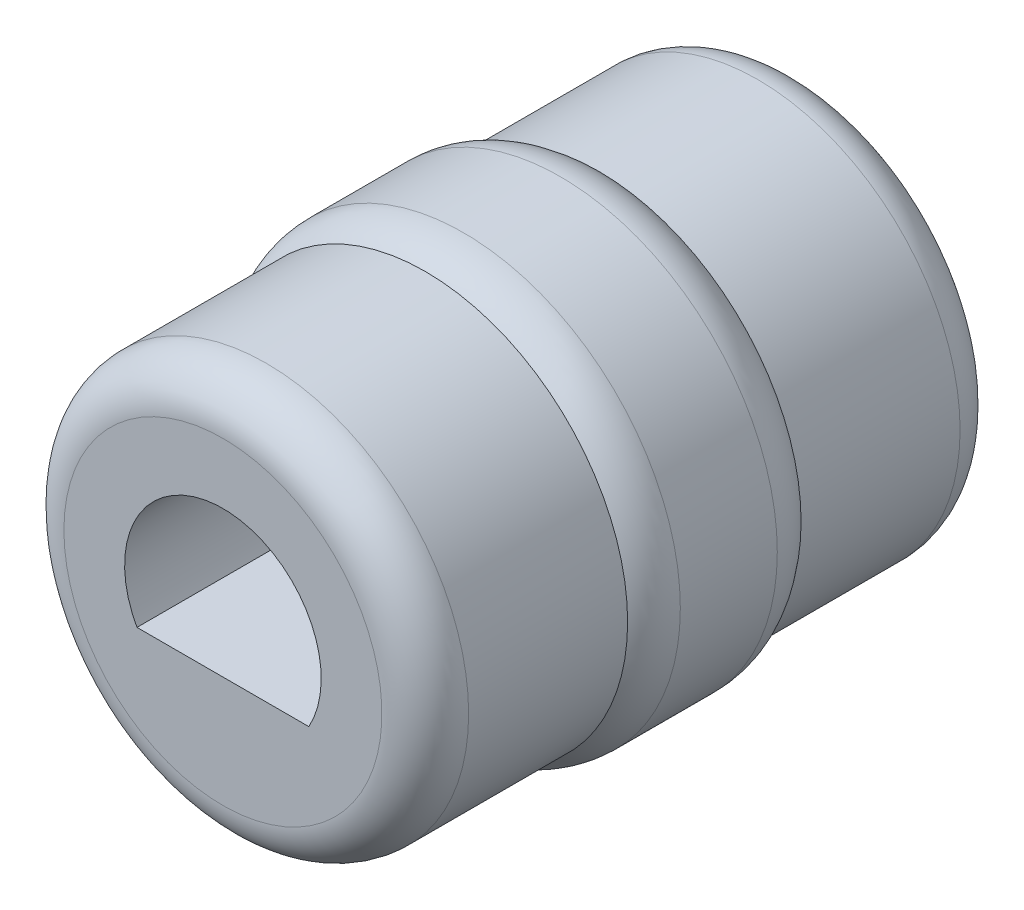
ISO-10303-21;
HEADER;
FILE_DESCRIPTION(('STEP AP214'),'2;1');
FILE_NAME('part.step','',(''),(''),'','','');
FILE_SCHEMA(('AUTOMOTIVE_DESIGN { 1 0 10303 214 1 1 1 1 }'));
ENDSEC;
DATA;
#1=APPLICATION_CONTEXT('core data for automotive mechanical design processes');
#2=APPLICATION_PROTOCOL_DEFINITION('international standard','automotive_design',2000,#1);
#3=PRODUCT_CONTEXT('',#1,'mechanical');
#4=PRODUCT('Part','Part','',(#3));
#5=PRODUCT_RELATED_PRODUCT_CATEGORY('part','',(#4));
#6=PRODUCT_DEFINITION_FORMATION('','',#4);
#7=PRODUCT_DEFINITION_CONTEXT('part definition',#1,'design');
#8=PRODUCT_DEFINITION('design','',#6,#7);
#9=PRODUCT_DEFINITION_SHAPE('','',#8);
#10=(LENGTH_UNIT() NAMED_UNIT(*) SI_UNIT(.MILLI.,.METRE.));
#11=(NAMED_UNIT(*) PLANE_ANGLE_UNIT() SI_UNIT($,.RADIAN.));
#12=(NAMED_UNIT(*) SI_UNIT($,.STERADIAN.) SOLID_ANGLE_UNIT());
#13=UNCERTAINTY_MEASURE_WITH_UNIT(LENGTH_MEASURE(1.E-05),#10,'distance_accuracy_value','');
#14=(GEOMETRIC_REPRESENTATION_CONTEXT(3) GLOBAL_UNCERTAINTY_ASSIGNED_CONTEXT((#13)) GLOBAL_UNIT_ASSIGNED_CONTEXT((#10,
#11,#12)) REPRESENTATION_CONTEXT('',''));
#15=CARTESIAN_POINT('',(0.,0.,0.));
#16=DIRECTION('',(0.,0.,1.));
#17=DIRECTION('',(1.,0.,0.));
#18=AXIS2_PLACEMENT_3D('',#15,#16,#17);
#19=CARTESIAN_POINT('',(0.,7.,0.));
#20=DIRECTION('',(0.,0.,-1.));
#21=DIRECTION('',(-1.,0.,0.));
#22=AXIS2_PLACEMENT_3D('',#19,#20,#21);
#23=PLANE('',#22);
#24=DIRECTION('',(-1.,0.,0.));
#25=VECTOR('',#24,1.);
#26=CARTESIAN_POINT('',(2.24599643810938,4.82,0.));
#27=LINE('',#26,#25);
#28=CARTESIAN_POINT('',(2.24599643810938,4.82,0.));
#29=VERTEX_POINT('',#28);
#30=CARTESIAN_POINT('',(-2.24599643810938,4.82,0.));
#31=VERTEX_POINT('',#30);
#32=EDGE_CURVE('E54',#29,#31,#27,.T.);
#33=ORIENTED_EDGE('',*,*,#32,.T.);
#34=CARTESIAN_POINT('',(0.,7.,0.));
#35=DIRECTION('',(0.,0.,-1.));
#36=DIRECTION('',(-1.,0.,0.));
#37=AXIS2_PLACEMENT_3D('',#34,#35,#36);
#38=CIRCLE('',#37,3.13);
#39=CARTESIAN_POINT('',(-2.65977442652568,5.35,0.));
#40=VERTEX_POINT('',#39);
#41=EDGE_CURVE('E109',#31,#40,#38,.T.);
#42=ORIENTED_EDGE('',*,*,#41,.T.);
#43=DIRECTION('',(1.,0.,0.));
#44=VECTOR('',#43,1.);
#45=CARTESIAN_POINT('',(2.97279329923895,5.35,0.));
#46=LINE('',#45,#44);
#47=CARTESIAN_POINT('',(2.65977442652568,5.35,0.));
#48=VERTEX_POINT('',#47);
#49=EDGE_CURVE('E151',#40,#48,#46,.T.);
#50=ORIENTED_EDGE('',*,*,#49,.T.);
#51=CARTESIAN_POINT('',(0.,7.,0.));
#52=DIRECTION('',(0.,0.,-1.));
#53=DIRECTION('',(-1.,0.,0.));
#54=AXIS2_PLACEMENT_3D('',#51,#52,#53);
#55=CIRCLE('',#54,3.13);
#56=EDGE_CURVE('E59',#48,#29,#55,.T.);
#57=ORIENTED_EDGE('',*,*,#56,.T.);
#58=EDGE_LOOP('',(#33,#42,#50,#57));
#59=FACE_BOUND('',#58,.T.);
#60=ADVANCED_FACE('F38',(#59),#23,.T.);
#61=CARTESIAN_POINT('',(0.,0.,0.));
#62=DIRECTION('',(0.,0.,1.));
#63=DIRECTION('',(1.,0.,0.));
#64=AXIS2_PLACEMENT_3D('',#61,#62,#63);
#65=PLANE('',#64);
#66=CARTESIAN_POINT('',(0.,7.,0.));
#67=DIRECTION('',(0.,0.,1.));
#68=DIRECTION('',(1.,0.,0.));
#69=AXIS2_PLACEMENT_3D('',#66,#67,#68);
#70=CIRCLE('',#69,3.4);
#71=CARTESIAN_POINT('',(2.97279329923895,5.35,0.));
#72=VERTEX_POINT('',#71);
#73=CARTESIAN_POINT('',(-2.97279329923895,5.35,0.));
#74=VERTEX_POINT('',#73);
#75=EDGE_CURVE('E145',#72,#74,#70,.T.);
#76=ORIENTED_EDGE('',*,*,#75,.T.);
#77=EDGE_CURVE('E106',#74,#40,#46,.T.);
#78=ORIENTED_EDGE('',*,*,#77,.T.);
#79=CARTESIAN_POINT('',(-2.24599643810938,9.18,0.));
#80=VERTEX_POINT('',#79);
#81=EDGE_CURVE('E99',#40,#80,#38,.T.);
#82=ORIENTED_EDGE('',*,*,#81,.T.);
#83=DIRECTION('',(1.,0.,0.));
#84=VECTOR('',#83,1.);
#85=CARTESIAN_POINT('',(-2.24599643810938,9.18,0.));
#86=LINE('',#85,#84);
#87=CARTESIAN_POINT('',(2.24599643810938,9.18,0.));
#88=VERTEX_POINT('',#87);
#89=EDGE_CURVE('E104',#80,#88,#86,.T.);
#90=ORIENTED_EDGE('',*,*,#89,.T.);
#91=EDGE_CURVE('E125',#88,#48,#55,.T.);
#92=ORIENTED_EDGE('',*,*,#91,.T.);
#93=EDGE_CURVE('E147',#48,#72,#46,.T.);
#94=ORIENTED_EDGE('',*,*,#93,.T.);
#95=EDGE_LOOP('',(#76,#78,#82,#90,#92,#94));
#96=FACE_BOUND('',#95,.T.);
#97=ADVANCED_FACE('F101',(#96),#65,.T.);
#98=CARTESIAN_POINT('',(-7.,14.,10.));
#99=DIRECTION('',(0.,0.,-1.));
#100=DIRECTION('',(-1.,0.,0.));
#101=AXIS2_PLACEMENT_3D('',#98,#99,#100);
#102=PLANE('',#101);
#103=CARTESIAN_POINT('',(0.,7.,10.));
#104=DIRECTION('',(0.,0.,1.));
#105=DIRECTION('',(1.,0.,0.));
#106=AXIS2_PLACEMENT_3D('',#103,#104,#105);
#107=CIRCLE('',#106,3.4);
#108=CARTESIAN_POINT('',(2.97279329923895,5.35,10.));
#109=VERTEX_POINT('',#108);
#110=CARTESIAN_POINT('',(-2.97279329923895,5.35,10.));
#111=VERTEX_POINT('',#110);
#112=EDGE_CURVE('E141',#109,#111,#107,.T.);
#113=ORIENTED_EDGE('',*,*,#112,.F.);
#114=DIRECTION('',(1.,0.,0.));
#115=VECTOR('',#114,1.);
#116=CARTESIAN_POINT('',(2.97279329923895,5.35,10.));
#117=LINE('',#116,#115);
#118=EDGE_CURVE('E148',#111,#109,#117,.T.);
#119=ORIENTED_EDGE('',*,*,#118,.F.);
#120=EDGE_LOOP('',(#113,#119));
#121=FACE_BOUND('',#120,.T.);
#122=CARTESIAN_POINT('',(0.,7.,10.));
#123=DIRECTION('',(0.,0.,-1.));
#124=DIRECTION('',(-1.,0.,0.));
#125=AXIS2_PLACEMENT_3D('',#122,#123,#124);
#126=CIRCLE('',#125,5.5);
#127=CARTESIAN_POINT('',(-5.5,7.,10.));
#128=VERTEX_POINT('',#127);
#129=EDGE_CURVE('E47',#128,#128,#126,.F.);
#130=ORIENTED_EDGE('',*,*,#129,.T.);
#131=EDGE_LOOP('',(#130));
#132=FACE_BOUND('',#131,.T.);
#133=ADVANCED_FACE('F185',(#121,#132),#102,.F.);
#134=CARTESIAN_POINT('',(0.,7.,-10.));
#135=DIRECTION('',(0.,0.,1.));
#136=DIRECTION('',(1.,0.,0.));
#137=AXIS2_PLACEMENT_3D('',#134,#135,#136);
#138=CYLINDRICAL_SURFACE('',#137,7.);
#139=CARTESIAN_POINT('',(0.,7.,-8.5));
#140=DIRECTION('',(0.,0.,1.));
#141=DIRECTION('',(1.,0.,0.));
#142=AXIS2_PLACEMENT_3D('',#139,#140,#141);
#143=CIRCLE('',#142,7.);
#144=CARTESIAN_POINT('',(7.,7.,-8.5));
#145=VERTEX_POINT('',#144);
#146=EDGE_CURVE('E173',#145,#145,#143,.T.);
#147=ORIENTED_EDGE('',*,*,#146,.T.);
#148=EDGE_LOOP('',(#147));
#149=FACE_BOUND('',#148,.T.);
#150=CARTESIAN_POINT('',(0.,7.,-3.));
#151=DIRECTION('',(0.,0.,1.));
#152=DIRECTION('',(1.,0.,0.));
#153=AXIS2_PLACEMENT_3D('',#150,#151,#152);
#154=CIRCLE('',#153,7.);
#155=CARTESIAN_POINT('',(7.,7.,-3.));
#156=VERTEX_POINT('',#155);
#157=EDGE_CURVE('E160',#156,#156,#154,.T.);
#158=ORIENTED_EDGE('',*,*,#157,.F.);
#159=EDGE_LOOP('',(#158));
#160=FACE_BOUND('',#159,.T.);
#161=ADVANCED_FACE('F389',(#149,#160),#138,.T.);
#162=CARTESIAN_POINT('',(0.,7.,8.5));
#163=DIRECTION('',(0.,0.,-1.));
#164=DIRECTION('',(-1.,0.,0.));
#165=AXIS2_PLACEMENT_3D('',#162,#163,#164);
#166=CIRCLE('',#165,7.);
#167=CARTESIAN_POINT('',(-7.,7.,8.5));
#168=VERTEX_POINT('',#167);
#169=EDGE_CURVE('E12',#168,#168,#166,.T.);
#170=ORIENTED_EDGE('',*,*,#169,.T.);
#171=EDGE_LOOP('',(#170));
#172=FACE_BOUND('',#171,.T.);
#173=CARTESIAN_POINT('',(0.,7.,3.));
#174=DIRECTION('',(0.,0.,1.));
#175=DIRECTION('',(1.,0.,0.));
#176=AXIS2_PLACEMENT_3D('',#173,#174,#175);
#177=CIRCLE('',#176,7.);
#178=CARTESIAN_POINT('',(7.,7.,3.));
#179=VERTEX_POINT('',#178);
#180=EDGE_CURVE('E163',#179,#179,#177,.F.);
#181=ORIENTED_EDGE('',*,*,#180,.F.);
#182=EDGE_LOOP('',(#181));
#183=FACE_BOUND('',#182,.T.);
#184=ADVANCED_FACE('F221',(#172,#183),#138,.T.);
#185=CARTESIAN_POINT('',(-7.,14.,-10.));
#186=DIRECTION('',(0.,0.,1.));
#187=DIRECTION('',(1.,0.,0.));
#188=AXIS2_PLACEMENT_3D('',#185,#186,#187);
#189=PLANE('',#188);
#190=CARTESIAN_POINT('',(0.,7.,-10.));
#191=DIRECTION('',(0.,0.,1.));
#192=DIRECTION('',(1.,0.,0.));
#193=AXIS2_PLACEMENT_3D('',#190,#191,#192);
#194=CIRCLE('',#193,5.5);
#195=CARTESIAN_POINT('',(5.5,7.,-10.));
#196=VERTEX_POINT('',#195);
#197=EDGE_CURVE('E180',#196,#196,#194,.F.);
#198=ORIENTED_EDGE('',*,*,#197,.T.);
#199=EDGE_LOOP('',(#198));
#200=FACE_BOUND('',#199,.T.);
#201=CARTESIAN_POINT('',(0.,7.,-10.));
#202=DIRECTION('',(0.,0.,-1.));
#203=DIRECTION('',(-1.,0.,0.));
#204=AXIS2_PLACEMENT_3D('',#201,#202,#203);
#205=CIRCLE('',#204,3.13);
#206=CARTESIAN_POINT('',(-2.24599643810938,4.82,-10.));
#207=VERTEX_POINT('',#206);
#208=CARTESIAN_POINT('',(-2.24599643810938,9.18,-10.));
#209=VERTEX_POINT('',#208);
#210=EDGE_CURVE('E116',#207,#209,#205,.T.);
#211=ORIENTED_EDGE('',*,*,#210,.F.);
#212=DIRECTION('',(-1.,0.,0.));
#213=VECTOR('',#212,1.);
#214=CARTESIAN_POINT('',(2.24599643810938,4.82,-10.));
#215=LINE('',#214,#213);
#216=CARTESIAN_POINT('',(2.24599643810938,4.82,-10.));
#217=VERTEX_POINT('',#216);
#218=EDGE_CURVE('E110',#217,#207,#215,.T.);
#219=ORIENTED_EDGE('',*,*,#218,.F.);
#220=CARTESIAN_POINT('',(0.,7.,-10.));
#221=DIRECTION('',(0.,0.,-1.));
#222=DIRECTION('',(-1.,0.,0.));
#223=AXIS2_PLACEMENT_3D('',#220,#221,#222);
#224=CIRCLE('',#223,3.13);
#225=CARTESIAN_POINT('',(2.24599643810938,9.18,-10.));
#226=VERTEX_POINT('',#225);
#227=EDGE_CURVE('E134',#226,#217,#224,.T.);
#228=ORIENTED_EDGE('',*,*,#227,.F.);
#229=DIRECTION('',(1.,0.,0.));
#230=VECTOR('',#229,1.);
#231=CARTESIAN_POINT('',(-2.24599643810938,9.18,-10.));
#232=LINE('',#231,#230);
#233=EDGE_CURVE('E131',#209,#226,#232,.T.);
#234=ORIENTED_EDGE('',*,*,#233,.F.);
#235=EDGE_LOOP('',(#211,#219,#228,#234));
#236=FACE_BOUND('',#235,.T.);
#237=ADVANCED_FACE('F210',(#200,#236),#189,.F.);
#238=CARTESIAN_POINT('',(0.,7.,3.));
#239=DIRECTION('',(0.,0.,-1.));
#240=DIRECTION('',(-1.,0.,0.));
#241=AXIS2_PLACEMENT_3D('',#238,#239,#240);
#242=CYLINDRICAL_SURFACE('',#241,7.5);
#243=CARTESIAN_POINT('',(0.,7.,-1.67712434446771));
#244=DIRECTION('',(0.,0.,-1.));
#245=DIRECTION('',(-1.,0.,0.));
#246=AXIS2_PLACEMENT_3D('',#243,#244,#245);
#247=CIRCLE('',#246,7.5);
#248=CARTESIAN_POINT('',(-7.5,7.,-1.67712434446771));
#249=VERTEX_POINT('',#248);
#250=EDGE_CURVE('E170',#249,#249,#247,.F.);
#251=ORIENTED_EDGE('',*,*,#250,.T.);
#252=EDGE_LOOP('',(#251));
#253=FACE_BOUND('',#252,.T.);
#254=CARTESIAN_POINT('',(0.,7.,1.67712434446771));
#255=DIRECTION('',(0.,0.,1.));
#256=DIRECTION('',(1.,0.,0.));
#257=AXIS2_PLACEMENT_3D('',#254,#255,#256);
#258=CIRCLE('',#257,7.5);
#259=CARTESIAN_POINT('',(7.5,7.,1.67712434446771));
#260=VERTEX_POINT('',#259);
#261=EDGE_CURVE('E167',#260,#260,#258,.F.);
#262=ORIENTED_EDGE('',*,*,#261,.T.);
#263=EDGE_LOOP('',(#262));
#264=FACE_BOUND('',#263,.T.);
#265=ADVANCED_FACE('F206',(#253,#264),#242,.T.);
#266=CARTESIAN_POINT('',(0.,7.,1.67712434446771));
#267=DIRECTION('',(0.,0.,1.));
#268=DIRECTION('',(1.,0.,0.));
#269=AXIS2_PLACEMENT_3D('',#266,#267,#268);
#270=TOROIDAL_SURFACE('',#269,5.5,2.);
#271=ORIENTED_EDGE('',*,*,#261,.F.);
#272=EDGE_LOOP('',(#271));
#273=FACE_BOUND('',#272,.T.);
#274=ORIENTED_EDGE('',*,*,#180,.T.);
#275=EDGE_LOOP('',(#274));
#276=FACE_BOUND('',#275,.T.);
#277=ADVANCED_FACE('F209',(#273,#276),#270,.T.);
#278=CARTESIAN_POINT('',(0.,7.,-1.67712434446771));
#279=DIRECTION('',(0.,0.,-1.));
#280=DIRECTION('',(-1.,0.,0.));
#281=AXIS2_PLACEMENT_3D('',#278,#279,#280);
#282=TOROIDAL_SURFACE('',#281,5.5,2.);
#283=ORIENTED_EDGE('',*,*,#157,.T.);
#284=EDGE_LOOP('',(#283));
#285=FACE_BOUND('',#284,.T.);
#286=ORIENTED_EDGE('',*,*,#250,.F.);
#287=EDGE_LOOP('',(#286));
#288=FACE_BOUND('',#287,.T.);
#289=ADVANCED_FACE('F257',(#285,#288),#282,.T.);
#290=CARTESIAN_POINT('',(0.,7.,0.));
#291=DIRECTION('',(0.,0.,1.));
#292=DIRECTION('',(1.,0.,0.));
#293=AXIS2_PLACEMENT_3D('',#290,#291,#292);
#294=CYLINDRICAL_SURFACE('',#293,3.4);
#295=ORIENTED_EDGE('',*,*,#112,.T.);
#296=DIRECTION('',(0.,0.,1.));
#297=VECTOR('',#296,1.);
#298=CARTESIAN_POINT('',(-2.97279329923895,5.35,0.));
#299=LINE('',#298,#297);
#300=EDGE_CURVE('E150',#74,#111,#299,.T.);
#301=ORIENTED_EDGE('',*,*,#300,.F.);
#302=ORIENTED_EDGE('',*,*,#75,.F.);
#303=DIRECTION('',(0.,0.,1.));
#304=VECTOR('',#303,1.);
#305=CARTESIAN_POINT('',(2.97279329923895,5.35,0.));
#306=LINE('',#305,#304);
#307=EDGE_CURVE('E154',#72,#109,#306,.T.);
#308=ORIENTED_EDGE('',*,*,#307,.T.);
#309=EDGE_LOOP('',(#295,#301,#302,#308));
#310=FACE_BOUND('',#309,.T.);
#311=ADVANCED_FACE('F254',(#310),#294,.F.);
#312=CARTESIAN_POINT('',(2.97279329923895,5.35,0.));
#313=DIRECTION('',(0.,-1.,0.));
#314=DIRECTION('',(1.,0.,0.));
#315=AXIS2_PLACEMENT_3D('',#312,#313,#314);
#316=PLANE('',#315);
#317=ORIENTED_EDGE('',*,*,#118,.T.);
#318=ORIENTED_EDGE('',*,*,#307,.F.);
#319=ORIENTED_EDGE('',*,*,#93,.F.);
#320=ORIENTED_EDGE('',*,*,#49,.F.);
#321=ORIENTED_EDGE('',*,*,#77,.F.);
#322=ORIENTED_EDGE('',*,*,#300,.T.);
#323=EDGE_LOOP('',(#317,#318,#319,#320,#321,#322));
#324=FACE_BOUND('',#323,.T.);
#325=ADVANCED_FACE('F251',(#324),#316,.F.);
#326=CARTESIAN_POINT('',(0.,7.,0.));
#327=DIRECTION('',(0.,0.,-1.));
#328=DIRECTION('',(-1.,0.,0.));
#329=AXIS2_PLACEMENT_3D('',#326,#327,#328);
#330=CYLINDRICAL_SURFACE('',#329,3.13);
#331=ORIENTED_EDGE('',*,*,#210,.T.);
#332=DIRECTION('',(0.,0.,-1.));
#333=VECTOR('',#332,1.);
#334=CARTESIAN_POINT('',(-2.24599643810938,9.18,0.));
#335=LINE('',#334,#333);
#336=EDGE_CURVE('E113',#80,#209,#335,.T.);
#337=ORIENTED_EDGE('',*,*,#336,.F.);
#338=ORIENTED_EDGE('',*,*,#81,.F.);
#339=ORIENTED_EDGE('',*,*,#41,.F.);
#340=DIRECTION('',(0.,0.,-1.));
#341=VECTOR('',#340,1.);
#342=CARTESIAN_POINT('',(-2.24599643810938,4.82,0.));
#343=LINE('',#342,#341);
#344=EDGE_CURVE('E139',#31,#207,#343,.T.);
#345=ORIENTED_EDGE('',*,*,#344,.T.);
#346=EDGE_LOOP('',(#331,#337,#338,#339,#345));
#347=FACE_BOUND('',#346,.T.);
#348=ADVANCED_FACE('F114',(#347),#330,.F.);
#349=CARTESIAN_POINT('',(2.24599643810938,4.82,0.));
#350=DIRECTION('',(0.,-1.,0.));
#351=DIRECTION('',(0.,0.,-1.));
#352=AXIS2_PLACEMENT_3D('',#349,#350,#351);
#353=PLANE('',#352);
#354=ORIENTED_EDGE('',*,*,#218,.T.);
#355=ORIENTED_EDGE('',*,*,#344,.F.);
#356=ORIENTED_EDGE('',*,*,#32,.F.);
#357=DIRECTION('',(0.,0.,-1.));
#358=VECTOR('',#357,1.);
#359=CARTESIAN_POINT('',(2.24599643810938,4.82,0.));
#360=LINE('',#359,#358);
#361=EDGE_CURVE('E142',#29,#217,#360,.T.);
#362=ORIENTED_EDGE('',*,*,#361,.T.);
#363=EDGE_LOOP('',(#354,#355,#356,#362));
#364=FACE_BOUND('',#363,.T.);
#365=ADVANCED_FACE('F238',(#364),#353,.F.);
#366=CARTESIAN_POINT('',(0.,7.,0.));
#367=DIRECTION('',(0.,0.,-1.));
#368=DIRECTION('',(-1.,0.,0.));
#369=AXIS2_PLACEMENT_3D('',#366,#367,#368);
#370=CYLINDRICAL_SURFACE('',#369,3.13);
#371=ORIENTED_EDGE('',*,*,#227,.T.);
#372=ORIENTED_EDGE('',*,*,#361,.F.);
#373=ORIENTED_EDGE('',*,*,#56,.F.);
#374=ORIENTED_EDGE('',*,*,#91,.F.);
#375=DIRECTION('',(0.,0.,-1.));
#376=VECTOR('',#375,1.);
#377=CARTESIAN_POINT('',(2.24599643810938,9.18,0.));
#378=LINE('',#377,#376);
#379=EDGE_CURVE('E120',#88,#226,#378,.T.);
#380=ORIENTED_EDGE('',*,*,#379,.T.);
#381=EDGE_LOOP('',(#371,#372,#373,#374,#380));
#382=FACE_BOUND('',#381,.T.);
#383=ADVANCED_FACE('F242',(#382),#370,.F.);
#384=CARTESIAN_POINT('',(-2.24599643810938,9.18,0.));
#385=DIRECTION('',(0.,1.,0.));
#386=DIRECTION('',(0.,0.,1.));
#387=AXIS2_PLACEMENT_3D('',#384,#385,#386);
#388=PLANE('',#387);
#389=ORIENTED_EDGE('',*,*,#233,.T.);
#390=ORIENTED_EDGE('',*,*,#379,.F.);
#391=ORIENTED_EDGE('',*,*,#89,.F.);
#392=ORIENTED_EDGE('',*,*,#336,.T.);
#393=EDGE_LOOP('',(#389,#390,#391,#392));
#394=FACE_BOUND('',#393,.T.);
#395=ADVANCED_FACE('F123',(#394),#388,.F.);
#396=CARTESIAN_POINT('',(0.,7.,-8.5));
#397=DIRECTION('',(0.,0.,1.));
#398=DIRECTION('',(1.,0.,0.));
#399=AXIS2_PLACEMENT_3D('',#396,#397,#398);
#400=TOROIDAL_SURFACE('',#399,5.5,1.5);
#401=ORIENTED_EDGE('',*,*,#197,.F.);
#402=EDGE_LOOP('',(#401));
#403=FACE_BOUND('',#402,.T.);
#404=ORIENTED_EDGE('',*,*,#146,.F.);
#405=EDGE_LOOP('',(#404));
#406=FACE_BOUND('',#405,.T.);
#407=ADVANCED_FACE('F188',(#403,#406),#400,.T.);
#408=CARTESIAN_POINT('',(0.,7.,8.5));
#409=DIRECTION('',(0.,0.,-1.));
#410=DIRECTION('',(-1.,0.,0.));
#411=AXIS2_PLACEMENT_3D('',#408,#409,#410);
#412=TOROIDAL_SURFACE('',#411,5.5,1.5);
#413=ORIENTED_EDGE('',*,*,#169,.F.);
#414=EDGE_LOOP('',(#413));
#415=FACE_BOUND('',#414,.T.);
#416=ORIENTED_EDGE('',*,*,#129,.F.);
#417=EDGE_LOOP('',(#416));
#418=FACE_BOUND('',#417,.T.);
#419=ADVANCED_FACE('F40',(#415,#418),#412,.T.);
#420=CLOSED_SHELL('',(#60,#97,#133,#161,#184,#237,#265,#277,#289,#311,#325,#348,#365,#383,#395,
#407,#419));
#421=CARTESIAN_POINT('',(2.49449393665328,9.8,0.));
#422=DIRECTION('',(0.,1.,0.));
#423=DIRECTION('',(0.,0.,1.));
#424=AXIS2_PLACEMENT_3D('',#421,#422,#423);
#425=PLANE('',#424);
#426=CARTESIAN_POINT('',(0.,9.8,-5.));
#427=DIRECTION('',(0.,1.,0.));
#428=DIRECTION('',(0.,0.,1.));
#429=AXIS2_PLACEMENT_3D('',#426,#427,#428);
#430=CIRCLE('',#429,1.3);
#431=CARTESIAN_POINT('',(0.,9.8,-3.7));
#432=VERTEX_POINT('',#431);
#433=EDGE_CURVE('E164',#432,#432,#430,.T.);
#434=ORIENTED_EDGE('',*,*,#433,.T.);
#435=EDGE_LOOP('',(#434));
#436=FACE_BOUND('',#435,.T.);
#437=ADVANCED_FACE('F217',(#436),#425,.T.);
#438=CARTESIAN_POINT('',(0.,16.,-5.));
#439=DIRECTION('',(0.,-1.,0.));
#440=DIRECTION('',(0.,0.,-1.));
#441=AXIS2_PLACEMENT_3D('',#438,#439,#440);
#442=CYLINDRICAL_SURFACE('',#441,1.3);
#443=ORIENTED_EDGE('',*,*,#433,.F.);
#444=EDGE_LOOP('',(#443));
#445=FACE_BOUND('',#444,.T.);
#446=CARTESIAN_POINT('',(0.,10.45,-6.3));
#447=CARTESIAN_POINT('',(-0.0703795584851381,10.4500019788307,-6.30000263192643));
#448=CARTESIAN_POINT('',(-0.140741182413693,10.4478277154498,-6.29426685147284));
#449=CARTESIAN_POINT('',(-0.279360319209436,10.4393716231162,-6.27156921673459));
#450=CARTESIAN_POINT('',(-0.347618155833325,10.4330904295268,-6.2546090989083));
#451=CARTESIAN_POINT('',(-0.480010462832588,10.4170943024435,-6.21014867327161));
#452=CARTESIAN_POINT('',(-0.544152653929277,10.4073860345864,-6.18266881758168));
#453=CARTESIAN_POINT('',(-0.666911647674217,10.385501662176,-6.1180535166097));
#454=CARTESIAN_POINT('',(-0.725526947406993,10.3733248891868,-6.08091545525135));
#455=CARTESIAN_POINT('',(-0.838078374004031,10.3471768316825,-5.99637737950212));
#456=CARTESIAN_POINT('',(-0.891746551702747,10.3331544220535,-5.94863658904205));
#457=CARTESIAN_POINT('',(-0.990531167447704,10.3051458567458,-5.84497167067664));
#458=CARTESIAN_POINT('',(-1.03564495097028,10.2911597136448,-5.78904501211367));
#459=CARTESIAN_POINT('',(-1.11775238914158,10.2642108248993,-5.66796814718764));
#460=CARTESIAN_POINT('',(-1.15436611293911,10.2513082900079,-5.60254554672075));
#461=CARTESIAN_POINT('',(-1.21595155774657,10.2287838497308,-5.4659085442823));
#462=CARTESIAN_POINT('',(-1.24092798007016,10.2191606199726,-5.39469649484979));
#463=CARTESIAN_POINT('',(-1.27746968524823,10.2048314048784,-5.25158750205943));
#464=CARTESIAN_POINT('',(-1.28954668048795,10.1999385938079,-5.17984056198543));
#465=CARTESIAN_POINT('',(-1.30154657479172,10.1950778830178,-5.03518442836543));
#466=CARTESIAN_POINT('',(-1.30147455598753,10.1951079239884,-4.96227573356275));
#467=CARTESIAN_POINT('',(-1.28956950723734,10.1999285612318,-4.82206399731379));
#468=CARTESIAN_POINT('',(-1.27844852078571,10.204430937324,-4.75468874315252));
#469=CARTESIAN_POINT('',(-1.24593906247421,10.2172096117033,-4.62284251865988));
#470=CARTESIAN_POINT('',(-1.22454902903671,10.225486483955,-4.55837199167161));
#471=CARTESIAN_POINT('',(-1.17172090095317,10.245053719155,-4.43272159687752));
#472=CARTESIAN_POINT('',(-1.14009930420375,10.2563984412869,-4.37162771869911));
#473=CARTESIAN_POINT('',(-1.06783365267813,10.2808052465285,-4.25540758390893));
#474=CARTESIAN_POINT('',(-1.02718646161882,10.2938679259624,-4.20028341162665));
#475=CARTESIAN_POINT('',(-0.934773547740356,10.3213208333789,-4.09362919323133));
#476=CARTESIAN_POINT('',(-0.882440217003721,10.3357409728285,-4.0425974517366));
#477=CARTESIAN_POINT('',(-0.769793349163745,10.3635219897467,-3.94988561359648));
#478=CARTESIAN_POINT('',(-0.709478564052975,10.3768827010361,-3.90820698218849));
#479=CARTESIAN_POINT('',(-0.581299827394499,10.4013096823917,-3.8348277152334));
#480=CARTESIAN_POINT('',(-0.513331947143163,10.4123365049619,-3.80329455437619));
#481=CARTESIAN_POINT('',(-0.37253700539505,10.4305602654186,-3.75227581800428));
#482=CARTESIAN_POINT('',(-0.299712140162138,10.4377589213128,-3.73278483755325));
#483=CARTESIAN_POINT('',(-0.15546306667227,10.4472124759046,-3.70736523344156));
#484=CARTESIAN_POINT('',(-0.0841729935761523,10.449711670364,-3.70076568674085));
#485=CARTESIAN_POINT('',(0.0585316012518492,10.4502406860481,-3.69936075475641));
#486=CARTESIAN_POINT('',(0.129946091483666,10.4482715096159,-3.70455272440451));
#487=CARTESIAN_POINT('',(0.26796302438504,10.4402461311041,-3.72607464412684));
#488=CARTESIAN_POINT('',(0.33464460945768,10.4343517862722,-3.74196376372879));
#489=CARTESIAN_POINT('',(0.464347464327293,10.4192320694502,-3.78384714354655));
#490=CARTESIAN_POINT('',(0.52736825699707,10.4100062643821,-3.80984271759964));
#491=CARTESIAN_POINT('',(0.650043753161841,10.3887954247397,-3.87203195823138));
#492=CARTESIAN_POINT('',(0.709544397215165,10.376737047929,-3.90850374310058));
#493=CARTESIAN_POINT('',(0.821781183931275,10.3511929434337,-3.99029613144768));
#494=CARTESIAN_POINT('',(0.874514800196947,10.3377066860746,-4.03562002393053));
#495=CARTESIAN_POINT('',(0.974953021189499,10.3098099793559,-4.13695416036388));
#496=CARTESIAN_POINT('',(1.02218196464631,10.2953916763572,-4.19343492464673));
#497=CARTESIAN_POINT('',(1.10658710452489,10.2680176702838,-4.31380178196348));
#498=CARTESIAN_POINT('',(1.14376235082231,10.2550621055126,-4.3776885740893));
#499=CARTESIAN_POINT('',(1.20705509561096,10.2321296916153,-4.51161010898553));
#500=CARTESIAN_POINT('',(1.23312208057028,10.2221665092957,-4.58167122425093));
#501=CARTESIAN_POINT('',(1.27291521332998,10.206657416602,-4.72566934208235));
#502=CARTESIAN_POINT('',(1.28664909715726,10.2011087374483,-4.79960388416414));
#503=CARTESIAN_POINT('',(1.30069136286961,10.1954270305449,-4.9440903722212));
#504=CARTESIAN_POINT('',(1.30181187170567,10.1949664388693,-5.01455115023448));
#505=CARTESIAN_POINT('',(1.29267989769098,10.198671997781,-5.15460102618035));
#506=CARTESIAN_POINT('',(1.28242851508682,10.2028377007678,-5.22419020778239));
#507=CARTESIAN_POINT('',(1.2514783559868,10.2150526580867,-5.35832197865347));
#508=CARTESIAN_POINT('',(1.23111459432206,10.2229770354851,-5.42295422159882));
#509=CARTESIAN_POINT('',(1.18081408790107,10.2417426051491,-5.54792168875672));
#510=CARTESIAN_POINT('',(1.15087491209022,10.2525845380276,-5.60825581698058));
#511=CARTESIAN_POINT('',(1.08044006255032,10.2766755045471,-5.72637747004071));
#512=CARTESIAN_POINT('',(1.03947058590381,10.2900213879827,-5.78386247042906));
#513=CARTESIAN_POINT('',(0.948868623930811,10.3172857174341,-5.89140084874912));
#514=CARTESIAN_POINT('',(0.89923337175345,10.3312043452304,-5.94145184364075));
#515=CARTESIAN_POINT('',(0.789455230933978,10.358963009336,-6.03550170555811));
#516=CARTESIAN_POINT('',(0.72888532005564,10.3727568581302,-6.07901801752599));
#517=CARTESIAN_POINT('',(0.600807323356668,10.3979090968105,-6.15524192124476));
#518=CARTESIAN_POINT('',(0.533298583458655,10.4092672567884,-6.18794849280588));
#519=CARTESIAN_POINT('',(0.389839487163554,10.4287022011399,-6.2426539477107));
#520=CARTESIAN_POINT('',(0.313640676037554,10.4365979334266,-6.2640718160485));
#521=CARTESIAN_POINT('',(0.15828599106991,10.447244397463,-6.29273971955094));
#522=CARTESIAN_POINT('',(0.0791316593188333,10.4499977750904,-6.29999704077846));
#523=CARTESIAN_POINT('',(0.,10.45,-6.3));
#524=B_SPLINE_CURVE_WITH_KNOTS('',3,(#446,#447,#448,#449,#450,#451,#452,#453,#454,#455,#456,
#457,#458,#459,#460,#461,#462,#463,#464,#465,#466,#467,#468,#469,#470,#471,#472,#473,#474,#475,
#476,#477,#478,#479,#480,#481,#482,#483,#484,#485,#486,#487,#488,#489,#490,#491,#492,#493,#494,
#495,#496,#497,#498,#499,#500,#501,#502,#503,#504,#505,#506,#507,#508,#509,#510,#511,#512,#513,
#514,#515,#516,#517,#518,#519,#520,#521,#522,#523),.UNSPECIFIED.,.T.,.F.,(4,2,2,2,2,2,2,2,2,2,2,
2,2,2,2,2,2,2,2,2,2,2,2,2,2,2,2,2,2,2,2,2,2,2,2,2,2,2,4),(0.,0.21084677334889,0.421660935321834,
0.632067304067771,0.842530724141586,1.06111800115166,1.27977299761689,1.506854432683,
1.73384405018412,1.95145030750426,2.16896553678494,2.373316683053,2.57769891412419,
2.78597128506762,2.99431614167415,3.21680984059094,3.43933837058068,3.66537137704879,
3.89130285844645,4.10512485506445,4.31889889195633,4.5243625550705,4.72985293736026,
4.9414028481535,5.15303151046605,5.37705927242671,5.6011081987317,5.82616536227662,
6.05108125828147,6.26142601196122,6.47175041626318,6.67553020933679,6.87936178017945,
7.09395250099152,7.30861186309028,7.53504559433066,7.76150068958579,7.99868953934578,
8.23575631549844),.UNSPECIFIED.);
#525=CARTESIAN_POINT('',(0.,10.45,-6.3));
#526=VERTEX_POINT('',#525);
#527=EDGE_CURVE('E132',#526,#526,#524,.T.);
#528=ORIENTED_EDGE('',*,*,#527,.T.);
#529=EDGE_LOOP('',(#528));
#530=FACE_BOUND('',#529,.T.);
#531=ADVANCED_FACE('F212',(#445,#530),#442,.F.);
#532=CARTESIAN_POINT('',(0.,7.,-10.));
#533=DIRECTION('',(0.,0.,1.));
#534=DIRECTION('',(1.,0.,0.));
#535=AXIS2_PLACEMENT_3D('',#532,#533,#534);
#536=CYLINDRICAL_SURFACE('',#535,3.45);
#537=ORIENTED_EDGE('',*,*,#527,.F.);
#538=EDGE_LOOP('',(#537));
#539=FACE_BOUND('',#538,.T.);
#540=ADVANCED_FACE('F216',(#539),#536,.F.);
#541=CLOSED_SHELL('',(#437,#531,#540));
#542=CARTESIAN_POINT('',(2.49449393665328,4.2,0.));
#543=DIRECTION('',(0.,-1.,0.));
#544=DIRECTION('',(1.,0.,0.));
#545=AXIS2_PLACEMENT_3D('',#542,#543,#544);
#546=PLANE('',#545);
#547=CARTESIAN_POINT('',(0.,4.2,-5.));
#548=DIRECTION('',(0.,-1.,0.));
#549=DIRECTION('',(0.,0.,-1.));
#550=AXIS2_PLACEMENT_3D('',#547,#548,#549);
#551=CIRCLE('',#550,1.3);
#552=CARTESIAN_POINT('',(0.,4.2,-6.3));
#553=VERTEX_POINT('',#552);
#554=EDGE_CURVE('E157',#553,#553,#551,.T.);
#555=ORIENTED_EDGE('',*,*,#554,.T.);
#556=EDGE_LOOP('',(#555));
#557=FACE_BOUND('',#556,.T.);
#558=ADVANCED_FACE('F204',(#557),#546,.T.);
#559=ORIENTED_EDGE('',*,*,#554,.F.);
#560=EDGE_LOOP('',(#559));
#561=FACE_BOUND('',#560,.T.);
#562=CARTESIAN_POINT('',(0.,3.55,-6.3));
#563=CARTESIAN_POINT('',(0.0703795584851392,3.54999802116932,-6.30000263192643));
#564=CARTESIAN_POINT('',(0.140741182413694,3.55217228455018,-6.29426685147284));
#565=CARTESIAN_POINT('',(0.279360319209437,3.56062837688382,-6.27156921673459));
#566=CARTESIAN_POINT('',(0.347618155833327,3.56690957047316,-6.2546090989083));
#567=CARTESIAN_POINT('',(0.480010462832589,3.58290569755645,-6.21014867327161));
#568=CARTESIAN_POINT('',(0.544152653929279,3.59261396541362,-6.18266881758168));
#569=CARTESIAN_POINT('',(0.666911647674219,3.61449833782404,-6.11805351660969));
#570=CARTESIAN_POINT('',(0.725526947406995,3.62667511081323,-6.08091545525135));
#571=CARTESIAN_POINT('',(0.838078374004032,3.65282316831745,-5.99637737950212));
#572=CARTESIAN_POINT('',(0.891746551702748,3.66684557794653,-5.94863658904205));
#573=CARTESIAN_POINT('',(0.990531167447706,3.69485414325415,-5.84497167067664));
#574=CARTESIAN_POINT('',(1.03564495097028,3.70884028635518,-5.78904501211367));
#575=CARTESIAN_POINT('',(1.11775238914159,3.73578917510069,-5.66796814718764));
#576=CARTESIAN_POINT('',(1.15436611293911,3.74869170999211,-5.60254554672075));
#577=CARTESIAN_POINT('',(1.21595155774657,3.77121615026925,-5.4659085442823));
#578=CARTESIAN_POINT('',(1.24092798007016,3.78083938002743,-5.39469649484979));
#579=CARTESIAN_POINT('',(1.27746968524823,3.79516859512158,-5.25158750205943));
#580=CARTESIAN_POINT('',(1.28954668048795,3.80006140619212,-5.17984056198543));
#581=CARTESIAN_POINT('',(1.30154657479172,3.80492211698218,-5.03518442836543));
#582=CARTESIAN_POINT('',(1.30147455598753,3.80489207601158,-4.96227573356275));
#583=CARTESIAN_POINT('',(1.28956950723734,3.80007143876822,-4.82206399731379));
#584=CARTESIAN_POINT('',(1.27844852078571,3.79556906267597,-4.75468874315252));
#585=CARTESIAN_POINT('',(1.24593906247421,3.7827903882967,-4.62284251865988));
#586=CARTESIAN_POINT('',(1.22454902903671,3.774513516045,-4.55837199167161));
#587=CARTESIAN_POINT('',(1.17172090095318,3.754946280845,-4.43272159687752));
#588=CARTESIAN_POINT('',(1.14009930420375,3.74360155871312,-4.37162771869911));
#589=CARTESIAN_POINT('',(1.06783365267813,3.71919475347152,-4.25540758390893));
#590=CARTESIAN_POINT('',(1.02718646161882,3.70613207403761,-4.20028341162665));
#591=CARTESIAN_POINT('',(0.934773547740358,3.67867916662106,-4.09362919323133));
#592=CARTESIAN_POINT('',(0.882440217003722,3.66425902717154,-4.0425974517366));
#593=CARTESIAN_POINT('',(0.769793349163747,3.6364780102533,-3.94988561359648));
#594=CARTESIAN_POINT('',(0.709478564052977,3.62311729896393,-3.90820698218849));
#595=CARTESIAN_POINT('',(0.581299827394501,3.5986903176083,-3.8348277152334));
#596=CARTESIAN_POINT('',(0.513331947143165,3.58766349503806,-3.80329455437619));
#597=CARTESIAN_POINT('',(0.372537005395052,3.56943973458143,-3.75227581800428));
#598=CARTESIAN_POINT('',(0.29971214016214,3.5622410786872,-3.73278483755325));
#599=CARTESIAN_POINT('',(0.155463066672272,3.55278752409536,-3.70736523344156));
#600=CARTESIAN_POINT('',(0.0841729935761539,3.55028832963597,-3.70076568674085));
#601=CARTESIAN_POINT('',(-0.0585316012518476,3.54975931395195,-3.69936075475641));
#602=CARTESIAN_POINT('',(-0.129946091483665,3.55172849038407,-3.70455272440451));
#603=CARTESIAN_POINT('',(-0.267963024385038,3.55975386889589,-3.72607464412684));
#604=CARTESIAN_POINT('',(-0.334644609457678,3.56564821372782,-3.74196376372879));
#605=CARTESIAN_POINT('',(-0.464347464327292,3.58076793054978,-3.78384714354655));
#606=CARTESIAN_POINT('',(-0.527368256997069,3.58999373561794,-3.80984271759964));
#607=CARTESIAN_POINT('',(-0.650043753161839,3.61120457526034,-3.87203195823138));
#608=CARTESIAN_POINT('',(-0.709544397215164,3.62326295207097,-3.90850374310058));
#609=CARTESIAN_POINT('',(-0.821781183931274,3.64880705656634,-3.99029613144768));
#610=CARTESIAN_POINT('',(-0.874514800196946,3.66229331392535,-4.03562002393053));
#611=CARTESIAN_POINT('',(-0.974953021189498,3.69019002064409,-4.13695416036388));
#612=CARTESIAN_POINT('',(-1.02218196464631,3.70460832364283,-4.19343492464673));
#613=CARTESIAN_POINT('',(-1.10658710452489,3.73198232971619,-4.31380178196348));
#614=CARTESIAN_POINT('',(-1.14376235082231,3.74493789448744,-4.3776885740893));
#615=CARTESIAN_POINT('',(-1.20705509561096,3.76787030838472,-4.51161010898553));
#616=CARTESIAN_POINT('',(-1.23312208057028,3.7778334907043,-4.58167122425093));
#617=CARTESIAN_POINT('',(-1.27291521332998,3.79334258339803,-4.72566934208235));
#618=CARTESIAN_POINT('',(-1.28664909715726,3.79889126255174,-4.79960388416414));
#619=CARTESIAN_POINT('',(-1.30069136286961,3.80457296945509,-4.94409037222119));
#620=CARTESIAN_POINT('',(-1.30181187170567,3.80503356113068,-5.01455115023448));
#621=CARTESIAN_POINT('',(-1.29267989769098,3.80132800221896,-5.15460102618035));
#622=CARTESIAN_POINT('',(-1.28242851508682,3.79716229923216,-5.22419020778239));
#623=CARTESIAN_POINT('',(-1.2514783559868,3.78494734191325,-5.35832197865347));
#624=CARTESIAN_POINT('',(-1.23111459432206,3.77702296451489,-5.42295422159882));
#625=CARTESIAN_POINT('',(-1.18081408790107,3.75825739485085,-5.54792168875672));
#626=CARTESIAN_POINT('',(-1.15087491209021,3.74741546197243,-5.60825581698058));
#627=CARTESIAN_POINT('',(-1.08044006255032,3.72332449545289,-5.7263774700407));
#628=CARTESIAN_POINT('',(-1.03947058590381,3.70997861201727,-5.78386247042906));
#629=CARTESIAN_POINT('',(-0.94886862393081,3.68271428256587,-5.89140084874912));
#630=CARTESIAN_POINT('',(-0.899233371753449,3.6687956547696,-5.94145184364075));
#631=CARTESIAN_POINT('',(-0.789455230933977,3.64103699066402,-6.03550170555811));
#632=CARTESIAN_POINT('',(-0.728885320055639,3.62724314186984,-6.07901801752599));
#633=CARTESIAN_POINT('',(-0.600807323356667,3.60209090318949,-6.15524192124476));
#634=CARTESIAN_POINT('',(-0.533298583458654,3.59073274321158,-6.18794849280588));
#635=CARTESIAN_POINT('',(-0.389839487163552,3.57129779886013,-6.2426539477107));
#636=CARTESIAN_POINT('',(-0.313640676037553,3.56340206657339,-6.2640718160485));
#637=CARTESIAN_POINT('',(-0.158285991069909,3.55275560253701,-6.29273971955094));
#638=CARTESIAN_POINT('',(-0.079131659318832,3.5500022249096,-6.29999704077846));
#639=CARTESIAN_POINT('',(0.,3.55,-6.3));
#640=B_SPLINE_CURVE_WITH_KNOTS('',3,(#562,#563,#564,#565,#566,#567,#568,#569,#570,#571,#572,
#573,#574,#575,#576,#577,#578,#579,#580,#581,#582,#583,#584,#585,#586,#587,#588,#589,#590,#591,
#592,#593,#594,#595,#596,#597,#598,#599,#600,#601,#602,#603,#604,#605,#606,#607,#608,#609,#610,
#611,#612,#613,#614,#615,#616,#617,#618,#619,#620,#621,#622,#623,#624,#625,#626,#627,#628,#629,
#630,#631,#632,#633,#634,#635,#636,#637,#638,#639),.UNSPECIFIED.,.T.,.F.,(4,2,2,2,2,2,2,2,2,2,2,
2,2,2,2,2,2,2,2,2,2,2,2,2,2,2,2,2,2,2,2,2,2,2,2,2,2,2,4),(0.,0.21084677334889,0.421660935321834,
0.632067304067772,0.842530724141586,1.06111800115166,1.27977299761689,1.506854432683,
1.73384405018412,1.95145030750426,2.16896553678494,2.373316683053,2.57769891412419,
2.78597128506762,2.99431614167415,3.21680984059094,3.43933837058068,3.66537137704879,
3.89130285844645,4.10512485506445,4.31889889195633,4.5243625550705,4.72985293736026,
4.9414028481535,5.15303151046605,5.37705927242671,5.6011081987317,5.82616536227662,
6.05108125828147,6.26142601196122,6.47175041626318,6.67553020933678,6.87936178017944,
7.09395250099152,7.30861186309028,7.53504559433066,7.76150068958579,7.99868953934578,
8.23575631549844),.UNSPECIFIED.);
#641=CARTESIAN_POINT('',(0.,3.55,-6.3));
#642=VERTEX_POINT('',#641);
#643=EDGE_CURVE('E228',#642,#642,#640,.T.);
#644=ORIENTED_EDGE('',*,*,#643,.T.);
#645=EDGE_LOOP('',(#644));
#646=FACE_BOUND('',#645,.T.);
#647=ADVANCED_FACE('F219',(#561,#646),#442,.F.);
#648=ORIENTED_EDGE('',*,*,#643,.F.);
#649=EDGE_LOOP('',(#648));
#650=FACE_BOUND('',#649,.T.);
#651=ADVANCED_FACE('F237',(#650),#536,.F.);
#652=CLOSED_SHELL('',(#558,#647,#651));
#653=ORIENTED_CLOSED_SHELL('',*,#541,.T.);
#654=ORIENTED_CLOSED_SHELL('',*,#652,.T.);
#655=BREP_WITH_VOIDS('B2',#420,(#653,#654));
#656=ADVANCED_BREP_SHAPE_REPRESENTATION('',(#18,#655),#14);
#657=SHAPE_DEFINITION_REPRESENTATION(#9,#656);
ENDSEC;
END-ISO-10303-21;
